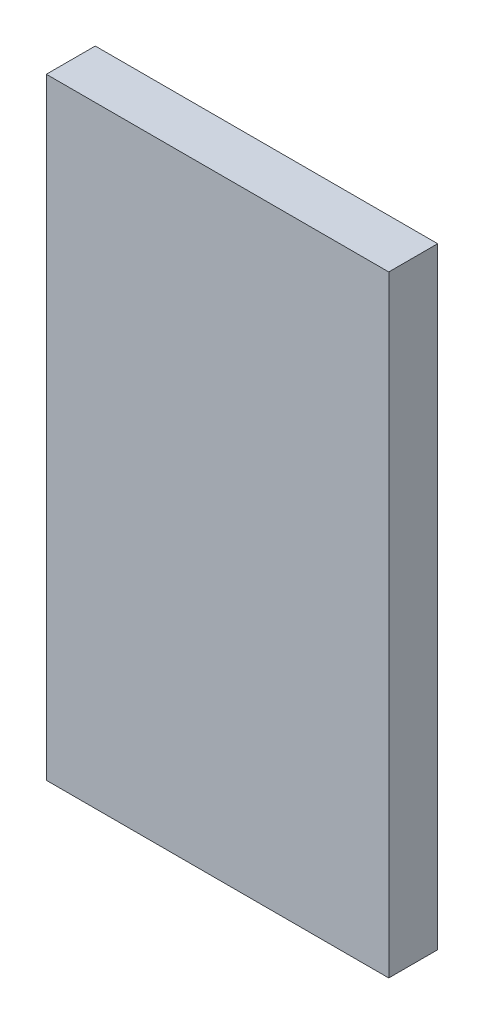
ISO-10303-21;
HEADER;
FILE_DESCRIPTION(('STEP AP214'),'2;1');
FILE_NAME('part.step','',(''),(''),'','','');
FILE_SCHEMA(('AUTOMOTIVE_DESIGN { 1 0 10303 214 1 1 1 1 }'));
ENDSEC;
DATA;
#1=APPLICATION_CONTEXT('core data for automotive mechanical design processes');
#2=APPLICATION_PROTOCOL_DEFINITION('international standard','automotive_design',2000,#1);
#3=PRODUCT_CONTEXT('',#1,'mechanical');
#4=PRODUCT('Part','Part','',(#3));
#5=PRODUCT_RELATED_PRODUCT_CATEGORY('part','',(#4));
#6=PRODUCT_DEFINITION_FORMATION('','',#4);
#7=PRODUCT_DEFINITION_CONTEXT('part definition',#1,'design');
#8=PRODUCT_DEFINITION('design','',#6,#7);
#9=PRODUCT_DEFINITION_SHAPE('','',#8);
#10=(LENGTH_UNIT() NAMED_UNIT(*) SI_UNIT(.MILLI.,.METRE.));
#11=(NAMED_UNIT(*) PLANE_ANGLE_UNIT() SI_UNIT($,.RADIAN.));
#12=(NAMED_UNIT(*) SI_UNIT($,.STERADIAN.) SOLID_ANGLE_UNIT());
#13=UNCERTAINTY_MEASURE_WITH_UNIT(LENGTH_MEASURE(1.E-05),#10,'distance_accuracy_value','');
#14=(GEOMETRIC_REPRESENTATION_CONTEXT(3) GLOBAL_UNCERTAINTY_ASSIGNED_CONTEXT((#13)) GLOBAL_UNIT_ASSIGNED_CONTEXT((#10,
#11,#12)) REPRESENTATION_CONTEXT('',''));
#15=CARTESIAN_POINT('',(0.,0.,0.));
#16=DIRECTION('',(0.,0.,1.));
#17=DIRECTION('',(1.,0.,0.));
#18=AXIS2_PLACEMENT_3D('',#15,#16,#17);
#19=CARTESIAN_POINT('',(70.,-125.,20.));
#20=DIRECTION('',(-1.,0.,0.));
#21=DIRECTION('',(0.,0.,1.));
#22=AXIS2_PLACEMENT_3D('',#19,#20,#21);
#23=PLANE('',#22);
#24=DIRECTION('',(0.,1.,0.));
#25=VECTOR('',#24,1.);
#26=CARTESIAN_POINT('',(70.,-125.,0.));
#27=LINE('',#26,#25);
#28=CARTESIAN_POINT('',(70.,-125.,0.));
#29=VERTEX_POINT('',#28);
#30=CARTESIAN_POINT('',(70.,125.,0.));
#31=VERTEX_POINT('',#30);
#32=EDGE_CURVE('E96',#29,#31,#27,.T.);
#33=ORIENTED_EDGE('',*,*,#32,.T.);
#34=DIRECTION('',(0.,0.,-1.));
#35=VECTOR('',#34,1.);
#36=CARTESIAN_POINT('',(70.,125.,20.));
#37=LINE('',#36,#35);
#38=CARTESIAN_POINT('',(70.,125.,20.));
#39=VERTEX_POINT('',#38);
#40=EDGE_CURVE('E11',#39,#31,#37,.T.);
#41=ORIENTED_EDGE('',*,*,#40,.F.);
#42=DIRECTION('',(0.,1.,0.));
#43=VECTOR('',#42,1.);
#44=CARTESIAN_POINT('',(70.,-125.,20.));
#45=LINE('',#44,#43);
#46=CARTESIAN_POINT('',(70.,-125.,20.));
#47=VERTEX_POINT('',#46);
#48=EDGE_CURVE('E84',#47,#39,#45,.T.);
#49=ORIENTED_EDGE('',*,*,#48,.F.);
#50=DIRECTION('',(0.,0.,-1.));
#51=VECTOR('',#50,1.);
#52=CARTESIAN_POINT('',(70.,-125.,20.));
#53=LINE('',#52,#51);
#54=EDGE_CURVE('E92',#47,#29,#53,.T.);
#55=ORIENTED_EDGE('',*,*,#54,.T.);
#56=EDGE_LOOP('',(#33,#41,#49,#55));
#57=FACE_BOUND('',#56,.T.);
#58=ADVANCED_FACE('F33',(#57),#23,.F.);
#59=CARTESIAN_POINT('',(-70.,125.,20.));
#60=DIRECTION('',(0.,-1.,0.));
#61=DIRECTION('',(0.,0.,-1.));
#62=AXIS2_PLACEMENT_3D('',#59,#60,#61);
#63=PLANE('',#62);
#64=DIRECTION('',(-1.,0.,0.));
#65=VECTOR('',#64,1.);
#66=CARTESIAN_POINT('',(-70.,125.,0.));
#67=LINE('',#66,#65);
#68=CARTESIAN_POINT('',(-70.,125.,0.));
#69=VERTEX_POINT('',#68);
#70=EDGE_CURVE('E88',#31,#69,#67,.T.);
#71=ORIENTED_EDGE('',*,*,#70,.T.);
#72=DIRECTION('',(0.,0.,-1.));
#73=VECTOR('',#72,1.);
#74=CARTESIAN_POINT('',(-70.,125.,20.));
#75=LINE('',#74,#73);
#76=CARTESIAN_POINT('',(-70.,125.,20.));
#77=VERTEX_POINT('',#76);
#78=EDGE_CURVE('E41',#77,#69,#75,.T.);
#79=ORIENTED_EDGE('',*,*,#78,.F.);
#80=DIRECTION('',(-1.,0.,0.));
#81=VECTOR('',#80,1.);
#82=CARTESIAN_POINT('',(-70.,125.,20.));
#83=LINE('',#82,#81);
#84=EDGE_CURVE('E79',#39,#77,#83,.T.);
#85=ORIENTED_EDGE('',*,*,#84,.F.);
#86=ORIENTED_EDGE('',*,*,#40,.T.);
#87=EDGE_LOOP('',(#71,#79,#85,#86));
#88=FACE_BOUND('',#87,.T.);
#89=ADVANCED_FACE('F87',(#88),#63,.F.);
#90=CARTESIAN_POINT('',(-70.,-125.,20.));
#91=DIRECTION('',(1.,0.,0.));
#92=DIRECTION('',(0.,0.,-1.));
#93=AXIS2_PLACEMENT_3D('',#90,#91,#92);
#94=PLANE('',#93);
#95=DIRECTION('',(0.,-1.,0.));
#96=VECTOR('',#95,1.);
#97=CARTESIAN_POINT('',(-70.,-125.,0.));
#98=LINE('',#97,#96);
#99=CARTESIAN_POINT('',(-70.,-125.,0.));
#100=VERTEX_POINT('',#99);
#101=EDGE_CURVE('E66',#69,#100,#98,.T.);
#102=ORIENTED_EDGE('',*,*,#101,.T.);
#103=DIRECTION('',(0.,0.,-1.));
#104=VECTOR('',#103,1.);
#105=CARTESIAN_POINT('',(-70.,-125.,20.));
#106=LINE('',#105,#104);
#107=CARTESIAN_POINT('',(-70.,-125.,20.));
#108=VERTEX_POINT('',#107);
#109=EDGE_CURVE('E89',#108,#100,#106,.T.);
#110=ORIENTED_EDGE('',*,*,#109,.F.);
#111=DIRECTION('',(0.,-1.,0.));
#112=VECTOR('',#111,1.);
#113=CARTESIAN_POINT('',(-70.,-125.,20.));
#114=LINE('',#113,#112);
#115=EDGE_CURVE('E82',#77,#108,#114,.T.);
#116=ORIENTED_EDGE('',*,*,#115,.F.);
#117=ORIENTED_EDGE('',*,*,#78,.T.);
#118=EDGE_LOOP('',(#102,#110,#116,#117));
#119=FACE_BOUND('',#118,.T.);
#120=ADVANCED_FACE('F90',(#119),#94,.F.);
#121=CARTESIAN_POINT('',(-70.,-125.,20.));
#122=DIRECTION('',(0.,1.,0.));
#123=DIRECTION('',(0.,0.,1.));
#124=AXIS2_PLACEMENT_3D('',#121,#122,#123);
#125=PLANE('',#124);
#126=DIRECTION('',(1.,0.,0.));
#127=VECTOR('',#126,1.);
#128=CARTESIAN_POINT('',(-70.,-125.,0.));
#129=LINE('',#128,#127);
#130=EDGE_CURVE('E72',#100,#29,#129,.T.);
#131=ORIENTED_EDGE('',*,*,#130,.T.);
#132=ORIENTED_EDGE('',*,*,#54,.F.);
#133=DIRECTION('',(1.,0.,0.));
#134=VECTOR('',#133,1.);
#135=CARTESIAN_POINT('',(-70.,-125.,20.));
#136=LINE('',#135,#134);
#137=EDGE_CURVE('E49',#108,#47,#136,.T.);
#138=ORIENTED_EDGE('',*,*,#137,.F.);
#139=ORIENTED_EDGE('',*,*,#109,.T.);
#140=EDGE_LOOP('',(#131,#132,#138,#139));
#141=FACE_BOUND('',#140,.T.);
#142=ADVANCED_FACE('F103',(#141),#125,.F.);
#143=CARTESIAN_POINT('',(0.,0.,20.));
#144=DIRECTION('',(0.,0.,-1.));
#145=DIRECTION('',(-1.,0.,0.));
#146=AXIS2_PLACEMENT_3D('',#143,#144,#145);
#147=PLANE('',#146);
#148=ORIENTED_EDGE('',*,*,#48,.T.);
#149=ORIENTED_EDGE('',*,*,#84,.T.);
#150=ORIENTED_EDGE('',*,*,#115,.T.);
#151=ORIENTED_EDGE('',*,*,#137,.T.);
#152=EDGE_LOOP('',(#148,#149,#150,#151));
#153=FACE_BOUND('',#152,.T.);
#154=ADVANCED_FACE('F80',(#153),#147,.F.);
#155=CARTESIAN_POINT('',(0.,0.,0.));
#156=DIRECTION('',(0.,0.,-1.));
#157=DIRECTION('',(-1.,0.,0.));
#158=AXIS2_PLACEMENT_3D('',#155,#156,#157);
#159=PLANE('',#158);
#160=ORIENTED_EDGE('',*,*,#32,.F.);
#161=ORIENTED_EDGE('',*,*,#130,.F.);
#162=ORIENTED_EDGE('',*,*,#101,.F.);
#163=ORIENTED_EDGE('',*,*,#70,.F.);
#164=EDGE_LOOP('',(#160,#161,#162,#163));
#165=FACE_BOUND('',#164,.T.);
#166=ADVANCED_FACE('F106',(#165),#159,.T.);
#167=CLOSED_SHELL('',(#58,#89,#120,#142,#154,#166));
#168=MANIFOLD_SOLID_BREP('B2',#167);
#169=ADVANCED_BREP_SHAPE_REPRESENTATION('',(#18,#168),#14);
#170=SHAPE_DEFINITION_REPRESENTATION(#9,#169);
ENDSEC;
END-ISO-10303-21;
